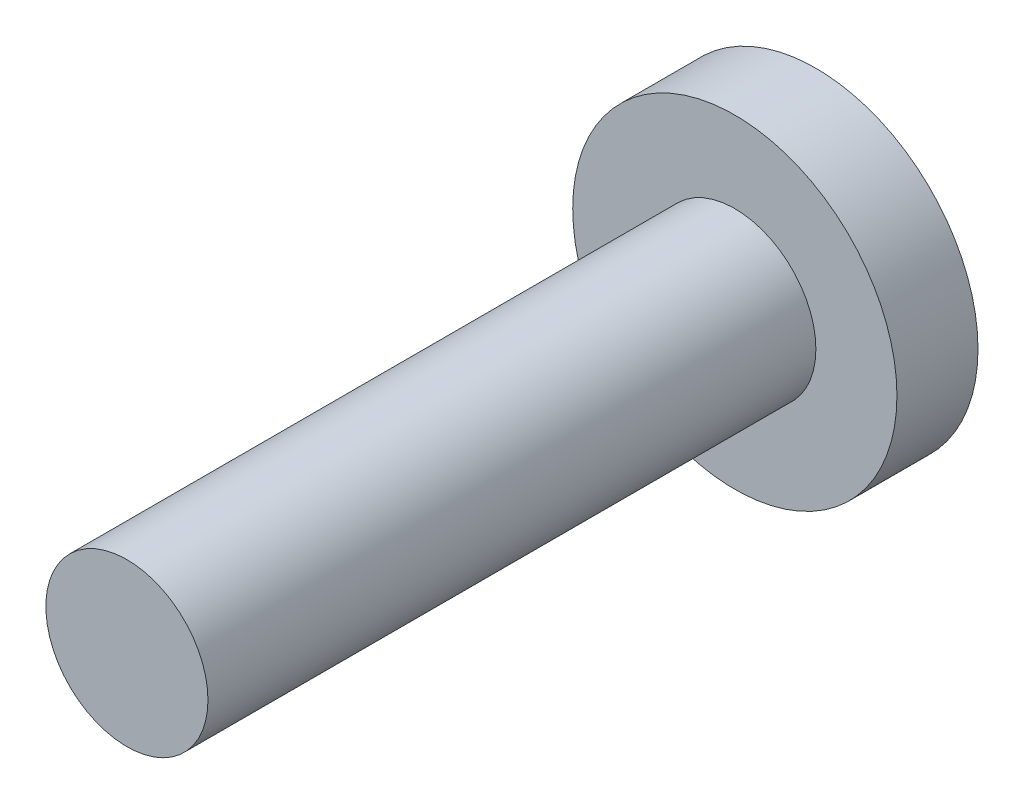
ISO-10303-21;
HEADER;
FILE_DESCRIPTION(('STEP AP214'),'2;1');
FILE_NAME('part.step','',(''),(''),'','','');
FILE_SCHEMA(('AUTOMOTIVE_DESIGN { 1 0 10303 214 1 1 1 1 }'));
ENDSEC;
DATA;
#1=APPLICATION_CONTEXT('core data for automotive mechanical design processes');
#2=APPLICATION_PROTOCOL_DEFINITION('international standard','automotive_design',2000,#1);
#3=PRODUCT_CONTEXT('',#1,'mechanical');
#4=PRODUCT('Part','Part','',(#3));
#5=PRODUCT_RELATED_PRODUCT_CATEGORY('part','',(#4));
#6=PRODUCT_DEFINITION_FORMATION('','',#4);
#7=PRODUCT_DEFINITION_CONTEXT('part definition',#1,'design');
#8=PRODUCT_DEFINITION('design','',#6,#7);
#9=PRODUCT_DEFINITION_SHAPE('','',#8);
#10=(LENGTH_UNIT() NAMED_UNIT(*) SI_UNIT(.MILLI.,.METRE.));
#11=(NAMED_UNIT(*) PLANE_ANGLE_UNIT() SI_UNIT($,.RADIAN.));
#12=(NAMED_UNIT(*) SI_UNIT($,.STERADIAN.) SOLID_ANGLE_UNIT());
#13=UNCERTAINTY_MEASURE_WITH_UNIT(LENGTH_MEASURE(1.E-05),#10,'distance_accuracy_value','');
#14=(GEOMETRIC_REPRESENTATION_CONTEXT(3) GLOBAL_UNCERTAINTY_ASSIGNED_CONTEXT((#13)) GLOBAL_UNIT_ASSIGNED_CONTEXT((#10,
#11,#12)) REPRESENTATION_CONTEXT('',''));
#15=CARTESIAN_POINT('',(0.,0.,0.));
#16=DIRECTION('',(0.,0.,1.));
#17=DIRECTION('',(1.,0.,0.));
#18=AXIS2_PLACEMENT_3D('',#15,#16,#17);
#19=CARTESIAN_POINT('',(0.,0.,0.));
#20=DIRECTION('',(0.,0.,-1.));
#21=DIRECTION('',(-1.,0.,0.));
#22=AXIS2_PLACEMENT_3D('',#19,#20,#21);
#23=CYLINDRICAL_SURFACE('',#22,2.);
#24=CARTESIAN_POINT('',(0.,0.,0.));
#25=DIRECTION('',(0.,0.,1.));
#26=DIRECTION('',(1.,0.,0.));
#27=AXIS2_PLACEMENT_3D('',#24,#25,#26);
#28=CIRCLE('',#27,2.);
#29=CARTESIAN_POINT('',(2.,0.,0.));
#30=VERTEX_POINT('',#29);
#31=EDGE_CURVE('E42',#30,#30,#28,.T.);
#32=ORIENTED_EDGE('',*,*,#31,.F.);
#33=EDGE_LOOP('',(#32));
#34=FACE_BOUND('',#33,.T.);
#35=CARTESIAN_POINT('',(0.,0.,-1.));
#36=DIRECTION('',(0.,0.,1.));
#37=DIRECTION('',(1.,0.,0.));
#38=AXIS2_PLACEMENT_3D('',#35,#36,#37);
#39=CIRCLE('',#38,2.);
#40=CARTESIAN_POINT('',(2.,0.,-1.));
#41=VERTEX_POINT('',#40);
#42=EDGE_CURVE('E37',#41,#41,#39,.T.);
#43=ORIENTED_EDGE('',*,*,#42,.T.);
#44=EDGE_LOOP('',(#43));
#45=FACE_BOUND('',#44,.T.);
#46=ADVANCED_FACE('F40',(#34,#45),#23,.T.);
#47=CARTESIAN_POINT('',(0.,0.,0.));
#48=DIRECTION('',(0.,0.,1.));
#49=DIRECTION('',(1.,0.,0.));
#50=AXIS2_PLACEMENT_3D('',#47,#48,#49);
#51=PLANE('',#50);
#52=CARTESIAN_POINT('',(0.,0.,0.));
#53=DIRECTION('',(0.,0.,1.));
#54=DIRECTION('',(1.,0.,0.));
#55=AXIS2_PLACEMENT_3D('',#52,#53,#54);
#56=CIRCLE('',#55,1.);
#57=CARTESIAN_POINT('',(1.,0.,0.));
#58=VERTEX_POINT('',#57);
#59=EDGE_CURVE('E10',#58,#58,#56,.T.);
#60=ORIENTED_EDGE('',*,*,#59,.F.);
#61=EDGE_LOOP('',(#60));
#62=FACE_BOUND('',#61,.T.);
#63=ORIENTED_EDGE('',*,*,#31,.T.);
#64=EDGE_LOOP('',(#63));
#65=FACE_BOUND('',#64,.T.);
#66=ADVANCED_FACE('F61',(#62,#65),#51,.T.);
#67=CARTESIAN_POINT('',(0.,0.,-1.));
#68=DIRECTION('',(0.,0.,1.));
#69=DIRECTION('',(1.,0.,0.));
#70=AXIS2_PLACEMENT_3D('',#67,#68,#69);
#71=PLANE('',#70);
#72=ORIENTED_EDGE('',*,*,#42,.F.);
#73=EDGE_LOOP('',(#72));
#74=FACE_BOUND('',#73,.T.);
#75=ADVANCED_FACE('F59',(#74),#71,.F.);
#76=CARTESIAN_POINT('',(0.,0.,7.5));
#77=DIRECTION('',(0.,0.,-1.));
#78=DIRECTION('',(-1.,0.,0.));
#79=AXIS2_PLACEMENT_3D('',#76,#77,#78);
#80=CYLINDRICAL_SURFACE('',#79,1.);
#81=CARTESIAN_POINT('',(0.,0.,7.5));
#82=DIRECTION('',(0.,0.,1.));
#83=DIRECTION('',(1.,0.,0.));
#84=AXIS2_PLACEMENT_3D('',#81,#82,#83);
#85=CIRCLE('',#84,1.);
#86=CARTESIAN_POINT('',(1.,0.,7.5));
#87=VERTEX_POINT('',#86);
#88=EDGE_CURVE('E49',#87,#87,#85,.T.);
#89=ORIENTED_EDGE('',*,*,#88,.F.);
#90=EDGE_LOOP('',(#89));
#91=FACE_BOUND('',#90,.T.);
#92=ORIENTED_EDGE('',*,*,#59,.T.);
#93=EDGE_LOOP('',(#92));
#94=FACE_BOUND('',#93,.T.);
#95=ADVANCED_FACE('F58',(#91,#94),#80,.T.);
#96=CARTESIAN_POINT('',(0.,0.,7.5));
#97=DIRECTION('',(0.,0.,1.));
#98=DIRECTION('',(1.,0.,0.));
#99=AXIS2_PLACEMENT_3D('',#96,#97,#98);
#100=PLANE('',#99);
#101=ORIENTED_EDGE('',*,*,#88,.T.);
#102=EDGE_LOOP('',(#101));
#103=FACE_BOUND('',#102,.T.);
#104=ADVANCED_FACE('F70',(#103),#100,.T.);
#105=CLOSED_SHELL('',(#46,#66,#75,#95,#104));
#106=MANIFOLD_SOLID_BREP('B2',#105);
#107=ADVANCED_BREP_SHAPE_REPRESENTATION('',(#18,#106),#14);
#108=SHAPE_DEFINITION_REPRESENTATION(#9,#107);
ENDSEC;
END-ISO-10303-21;
